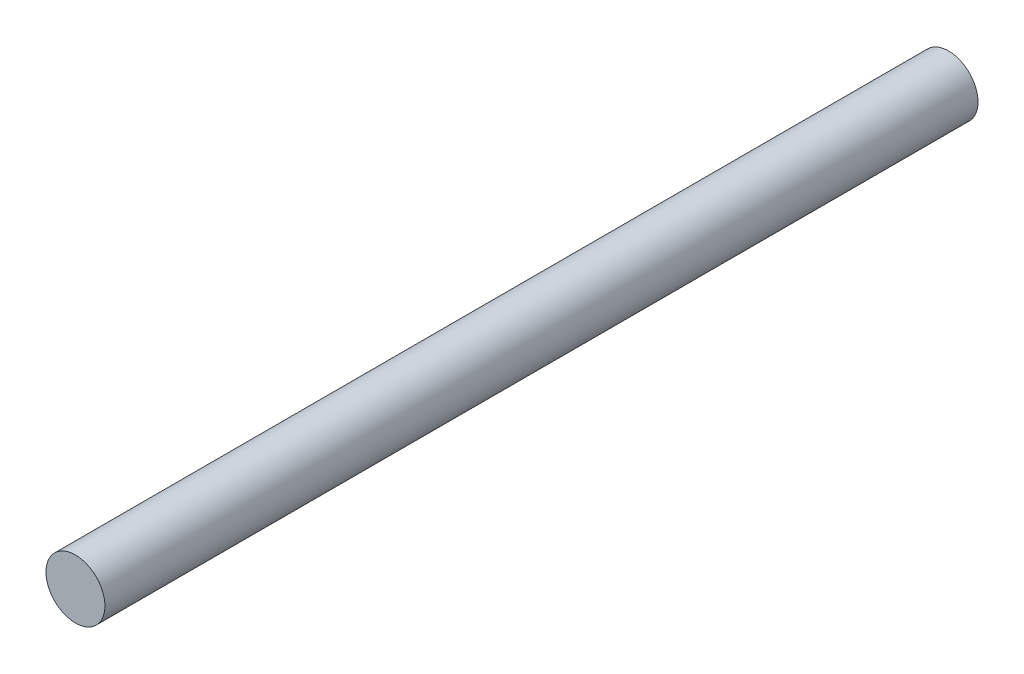
ISO-10303-21;
HEADER;
FILE_DESCRIPTION(('STEP AP214'),'2;1');
FILE_NAME('part.step','',(''),(''),'','','');
FILE_SCHEMA(('AUTOMOTIVE_DESIGN { 1 0 10303 214 1 1 1 1 }'));
ENDSEC;
DATA;
#1=APPLICATION_CONTEXT('core data for automotive mechanical design processes');
#2=APPLICATION_PROTOCOL_DEFINITION('international standard','automotive_design',2000,#1);
#3=PRODUCT_CONTEXT('',#1,'mechanical');
#4=PRODUCT('Part','Part','',(#3));
#5=PRODUCT_RELATED_PRODUCT_CATEGORY('part','',(#4));
#6=PRODUCT_DEFINITION_FORMATION('','',#4);
#7=PRODUCT_DEFINITION_CONTEXT('part definition',#1,'design');
#8=PRODUCT_DEFINITION('design','',#6,#7);
#9=PRODUCT_DEFINITION_SHAPE('','',#8);
#10=(LENGTH_UNIT() NAMED_UNIT(*) SI_UNIT(.MILLI.,.METRE.));
#11=(NAMED_UNIT(*) PLANE_ANGLE_UNIT() SI_UNIT($,.RADIAN.));
#12=(NAMED_UNIT(*) SI_UNIT($,.STERADIAN.) SOLID_ANGLE_UNIT());
#13=UNCERTAINTY_MEASURE_WITH_UNIT(LENGTH_MEASURE(1.E-05),#10,'distance_accuracy_value','');
#14=(GEOMETRIC_REPRESENTATION_CONTEXT(3) GLOBAL_UNCERTAINTY_ASSIGNED_CONTEXT((#13)) GLOBAL_UNIT_ASSIGNED_CONTEXT((#10,
#11,#12)) REPRESENTATION_CONTEXT('',''));
#15=CARTESIAN_POINT('',(0.,0.,0.));
#16=DIRECTION('',(0.,0.,1.));
#17=DIRECTION('',(1.,0.,0.));
#18=AXIS2_PLACEMENT_3D('',#15,#16,#17);
#19=CARTESIAN_POINT('',(0.,0.,94.));
#20=DIRECTION('',(0.,0.,-1.));
#21=DIRECTION('',(-1.,0.,0.));
#22=AXIS2_PLACEMENT_3D('',#19,#20,#21);
#23=CYLINDRICAL_SURFACE('',#22,3.175);
#24=CARTESIAN_POINT('',(0.,0.,94.));
#25=DIRECTION('',(0.,0.,1.));
#26=DIRECTION('',(1.,0.,0.));
#27=AXIS2_PLACEMENT_3D('',#24,#25,#26);
#28=CIRCLE('',#27,3.175);
#29=CARTESIAN_POINT('',(3.175,0.,94.));
#30=VERTEX_POINT('',#29);
#31=EDGE_CURVE('E10',#30,#30,#28,.T.);
#32=ORIENTED_EDGE('',*,*,#31,.F.);
#33=EDGE_LOOP('',(#32));
#34=FACE_BOUND('',#33,.T.);
#35=CARTESIAN_POINT('',(0.,0.,0.));
#36=DIRECTION('',(0.,0.,1.));
#37=DIRECTION('',(1.,0.,0.));
#38=AXIS2_PLACEMENT_3D('',#35,#36,#37);
#39=CIRCLE('',#38,3.175);
#40=CARTESIAN_POINT('',(3.175,0.,0.));
#41=VERTEX_POINT('',#40);
#42=EDGE_CURVE('E40',#41,#41,#39,.T.);
#43=ORIENTED_EDGE('',*,*,#42,.T.);
#44=EDGE_LOOP('',(#43));
#45=FACE_BOUND('',#44,.T.);
#46=ADVANCED_FACE('F37',(#34,#45),#23,.T.);
#47=CARTESIAN_POINT('',(0.,0.,94.));
#48=DIRECTION('',(0.,0.,1.));
#49=DIRECTION('',(1.,0.,0.));
#50=AXIS2_PLACEMENT_3D('',#47,#48,#49);
#51=PLANE('',#50);
#52=ORIENTED_EDGE('',*,*,#31,.T.);
#53=EDGE_LOOP('',(#52));
#54=FACE_BOUND('',#53,.T.);
#55=ADVANCED_FACE('F54',(#54),#51,.T.);
#56=CARTESIAN_POINT('',(0.,0.,0.));
#57=DIRECTION('',(0.,0.,1.));
#58=DIRECTION('',(1.,0.,0.));
#59=AXIS2_PLACEMENT_3D('',#56,#57,#58);
#60=PLANE('',#59);
#61=ORIENTED_EDGE('',*,*,#42,.F.);
#62=EDGE_LOOP('',(#61));
#63=FACE_BOUND('',#62,.T.);
#64=ADVANCED_FACE('F52',(#63),#60,.F.);
#65=CLOSED_SHELL('',(#46,#55,#64));
#66=MANIFOLD_SOLID_BREP('B2',#65);
#67=ADVANCED_BREP_SHAPE_REPRESENTATION('',(#18,#66),#14);
#68=SHAPE_DEFINITION_REPRESENTATION(#9,#67);
ENDSEC;
END-ISO-10303-21;
